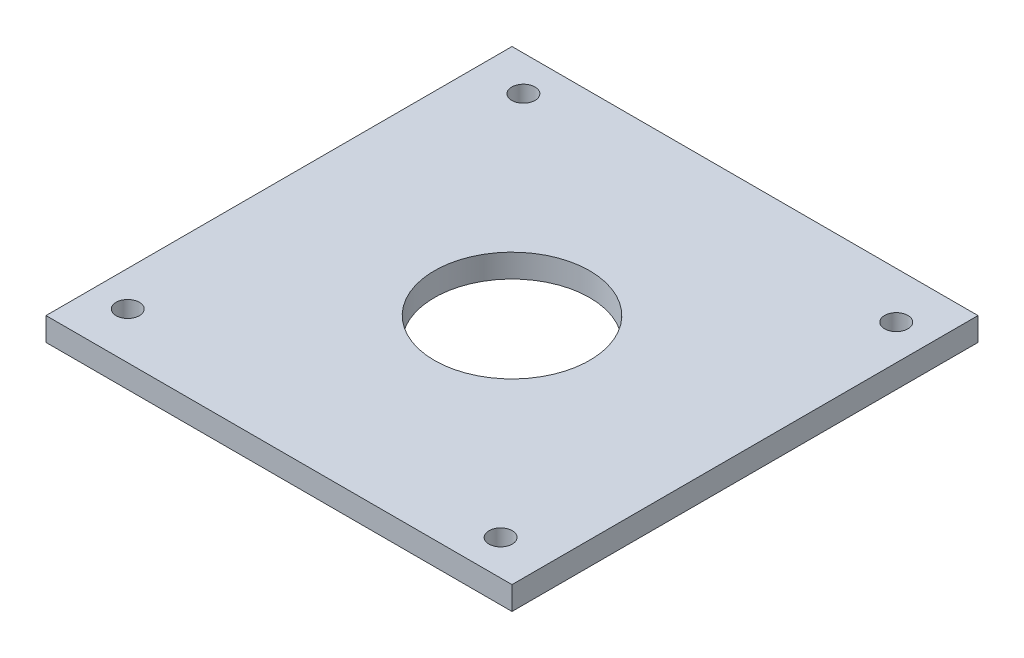
ISO-10303-21;
HEADER;
FILE_DESCRIPTION(('STEP AP214'),'2;1');
FILE_NAME('part.step','',(''),(''),'','','');
FILE_SCHEMA(('AUTOMOTIVE_DESIGN { 1 0 10303 214 1 1 1 1 }'));
ENDSEC;
DATA;
#1=APPLICATION_CONTEXT('core data for automotive mechanical design processes');
#2=APPLICATION_PROTOCOL_DEFINITION('international standard','automotive_design',2000,#1);
#3=PRODUCT_CONTEXT('',#1,'mechanical');
#4=PRODUCT('Part','Part','',(#3));
#5=PRODUCT_RELATED_PRODUCT_CATEGORY('part','',(#4));
#6=PRODUCT_DEFINITION_FORMATION('','',#4);
#7=PRODUCT_DEFINITION_CONTEXT('part definition',#1,'design');
#8=PRODUCT_DEFINITION('design','',#6,#7);
#9=PRODUCT_DEFINITION_SHAPE('','',#8);
#10=(LENGTH_UNIT() NAMED_UNIT(*) SI_UNIT(.MILLI.,.METRE.));
#11=(NAMED_UNIT(*) PLANE_ANGLE_UNIT() SI_UNIT($,.RADIAN.));
#12=(NAMED_UNIT(*) SI_UNIT($,.STERADIAN.) SOLID_ANGLE_UNIT());
#13=UNCERTAINTY_MEASURE_WITH_UNIT(LENGTH_MEASURE(1.E-05),#10,'distance_accuracy_value','');
#14=(GEOMETRIC_REPRESENTATION_CONTEXT(3) GLOBAL_UNCERTAINTY_ASSIGNED_CONTEXT((#13)) GLOBAL_UNIT_ASSIGNED_CONTEXT((#10,
#11,#12)) REPRESENTATION_CONTEXT('',''));
#15=CARTESIAN_POINT('',(0.,0.,0.));
#16=DIRECTION('',(0.,0.,1.));
#17=DIRECTION('',(1.,0.,0.));
#18=AXIS2_PLACEMENT_3D('',#15,#16,#17);
#19=CARTESIAN_POINT('',(0.,3.,0.));
#20=DIRECTION('',(0.,1.,0.));
#21=DIRECTION('',(0.,0.,1.));
#22=AXIS2_PLACEMENT_3D('',#19,#20,#21);
#23=PLANE('',#22);
#24=CARTESIAN_POINT('',(-25.4708550933274,3.,24.0049065987501));
#25=DIRECTION('',(0.,1.,0.));
#26=DIRECTION('',(0.,0.,1.));
#27=AXIS2_PLACEMENT_3D('',#24,#25,#26);
#28=CIRCLE('',#27,1.500000000001);
#29=CARTESIAN_POINT('',(-25.4708550933274,3.,25.5049065987511));
#30=VERTEX_POINT('',#29);
#31=EDGE_CURVE('E133',#30,#30,#28,.T.);
#32=ORIENTED_EDGE('',*,*,#31,.F.);
#33=EDGE_LOOP('',(#32));
#34=FACE_BOUND('',#33,.T.);
#35=CARTESIAN_POINT('',(0.,3.,0.));
#36=DIRECTION('',(0.,1.,0.));
#37=DIRECTION('',(0.,0.,1.));
#38=AXIS2_PLACEMENT_3D('',#35,#36,#37);
#39=CIRCLE('',#38,10.);
#40=CARTESIAN_POINT('',(0.,3.,10.));
#41=VERTEX_POINT('',#40);
#42=EDGE_CURVE('E121',#41,#41,#39,.T.);
#43=ORIENTED_EDGE('',*,*,#42,.F.);
#44=EDGE_LOOP('',(#43));
#45=FACE_BOUND('',#44,.T.);
#46=DIRECTION('',(0.,0.,-1.));
#47=VECTOR('',#46,1.);
#48=CARTESIAN_POINT('',(30.,3.,-30.));
#49=LINE('',#48,#47);
#50=CARTESIAN_POINT('',(30.,3.,30.));
#51=VERTEX_POINT('',#50);
#52=CARTESIAN_POINT('',(30.,3.,-30.));
#53=VERTEX_POINT('',#52);
#54=EDGE_CURVE('E91',#51,#53,#49,.T.);
#55=ORIENTED_EDGE('',*,*,#54,.T.);
#56=DIRECTION('',(-1.,0.,0.));
#57=VECTOR('',#56,1.);
#58=CARTESIAN_POINT('',(-30.,3.,-30.));
#59=LINE('',#58,#57);
#60=CARTESIAN_POINT('',(-30.,3.,-30.));
#61=VERTEX_POINT('',#60);
#62=EDGE_CURVE('E86',#53,#61,#59,.T.);
#63=ORIENTED_EDGE('',*,*,#62,.T.);
#64=DIRECTION('',(0.,0.,1.));
#65=VECTOR('',#64,1.);
#66=CARTESIAN_POINT('',(-30.,3.,-30.));
#67=LINE('',#66,#65);
#68=CARTESIAN_POINT('',(-30.,3.,30.));
#69=VERTEX_POINT('',#68);
#70=EDGE_CURVE('E89',#61,#69,#67,.T.);
#71=ORIENTED_EDGE('',*,*,#70,.T.);
#72=DIRECTION('',(1.,0.,0.));
#73=VECTOR('',#72,1.);
#74=CARTESIAN_POINT('',(-30.,3.,30.));
#75=LINE('',#74,#73);
#76=EDGE_CURVE('E56',#69,#51,#75,.T.);
#77=ORIENTED_EDGE('',*,*,#76,.T.);
#78=EDGE_LOOP('',(#55,#63,#71,#77));
#79=FACE_BOUND('',#78,.T.);
#80=CARTESIAN_POINT('',(25.4708550933288,3.,-24.0049065987487));
#81=DIRECTION('',(0.,1.,0.));
#82=DIRECTION('',(0.,0.,1.));
#83=AXIS2_PLACEMENT_3D('',#80,#81,#82);
#84=CIRCLE('',#83,1.5);
#85=CARTESIAN_POINT('',(25.4708550933288,3.,-22.5049065987487));
#86=VERTEX_POINT('',#85);
#87=EDGE_CURVE('E106',#86,#86,#84,.T.);
#88=ORIENTED_EDGE('',*,*,#87,.F.);
#89=EDGE_LOOP('',(#88));
#90=FACE_BOUND('',#89,.T.);
#91=CARTESIAN_POINT('',(24.0049065987501,3.,25.4708550933288));
#92=DIRECTION('',(0.,1.,0.));
#93=DIRECTION('',(0.,0.,1.));
#94=AXIS2_PLACEMENT_3D('',#91,#92,#93);
#95=CIRCLE('',#94,1.49999999999961);
#96=CARTESIAN_POINT('',(24.0049065987501,3.,26.9708550933284));
#97=VERTEX_POINT('',#96);
#98=EDGE_CURVE('E127',#97,#97,#95,.T.);
#99=ORIENTED_EDGE('',*,*,#98,.F.);
#100=EDGE_LOOP('',(#99));
#101=FACE_BOUND('',#100,.T.);
#102=CARTESIAN_POINT('',(-24.0049065987487,3.,-25.4708550933273));
#103=DIRECTION('',(0.,1.,0.));
#104=DIRECTION('',(0.,0.,1.));
#105=AXIS2_PLACEMENT_3D('',#102,#103,#104);
#106=CIRCLE('',#105,1.5000000000015);
#107=CARTESIAN_POINT('',(-24.0049065987487,3.,-23.9708550933258));
#108=VERTEX_POINT('',#107);
#109=EDGE_CURVE('E139',#108,#108,#106,.T.);
#110=ORIENTED_EDGE('',*,*,#109,.F.);
#111=EDGE_LOOP('',(#110));
#112=FACE_BOUND('',#111,.T.);
#113=ADVANCED_FACE('F39',(#34,#45,#79,#90,#101,#112),#23,.T.);
#114=CARTESIAN_POINT('',(0.,0.,0.));
#115=DIRECTION('',(0.,1.,0.));
#116=DIRECTION('',(0.,0.,1.));
#117=AXIS2_PLACEMENT_3D('',#114,#115,#116);
#118=PLANE('',#117);
#119=DIRECTION('',(0.,0.,-1.));
#120=VECTOR('',#119,1.);
#121=CARTESIAN_POINT('',(30.,0.,-30.));
#122=LINE('',#121,#120);
#123=CARTESIAN_POINT('',(30.,0.,30.));
#124=VERTEX_POINT('',#123);
#125=CARTESIAN_POINT('',(30.,0.,-30.));
#126=VERTEX_POINT('',#125);
#127=EDGE_CURVE('E103',#124,#126,#122,.T.);
#128=ORIENTED_EDGE('',*,*,#127,.F.);
#129=DIRECTION('',(1.,0.,0.));
#130=VECTOR('',#129,1.);
#131=CARTESIAN_POINT('',(-30.,0.,30.));
#132=LINE('',#131,#130);
#133=CARTESIAN_POINT('',(-30.,0.,30.));
#134=VERTEX_POINT('',#133);
#135=EDGE_CURVE('E79',#134,#124,#132,.T.);
#136=ORIENTED_EDGE('',*,*,#135,.F.);
#137=DIRECTION('',(0.,0.,1.));
#138=VECTOR('',#137,1.);
#139=CARTESIAN_POINT('',(-30.,0.,-30.));
#140=LINE('',#139,#138);
#141=CARTESIAN_POINT('',(-30.,0.,-30.));
#142=VERTEX_POINT('',#141);
#143=EDGE_CURVE('E73',#142,#134,#140,.T.);
#144=ORIENTED_EDGE('',*,*,#143,.F.);
#145=DIRECTION('',(-1.,0.,0.));
#146=VECTOR('',#145,1.);
#147=CARTESIAN_POINT('',(-30.,0.,-30.));
#148=LINE('',#147,#146);
#149=EDGE_CURVE('E95',#126,#142,#148,.T.);
#150=ORIENTED_EDGE('',*,*,#149,.F.);
#151=EDGE_LOOP('',(#128,#136,#144,#150));
#152=FACE_BOUND('',#151,.T.);
#153=CARTESIAN_POINT('',(25.4708550933288,0.,-24.0049065987487));
#154=DIRECTION('',(0.,1.,0.));
#155=DIRECTION('',(0.,0.,1.));
#156=AXIS2_PLACEMENT_3D('',#153,#154,#155);
#157=CIRCLE('',#156,1.5);
#158=CARTESIAN_POINT('',(25.4708550933288,0.,-22.5049065987487));
#159=VERTEX_POINT('',#158);
#160=EDGE_CURVE('E118',#159,#159,#157,.T.);
#161=ORIENTED_EDGE('',*,*,#160,.T.);
#162=EDGE_LOOP('',(#161));
#163=FACE_BOUND('',#162,.T.);
#164=CARTESIAN_POINT('',(0.,0.,0.));
#165=DIRECTION('',(0.,1.,0.));
#166=DIRECTION('',(0.,0.,1.));
#167=AXIS2_PLACEMENT_3D('',#164,#165,#166);
#168=CIRCLE('',#167,10.);
#169=CARTESIAN_POINT('',(0.,0.,10.));
#170=VERTEX_POINT('',#169);
#171=EDGE_CURVE('E124',#170,#170,#168,.T.);
#172=ORIENTED_EDGE('',*,*,#171,.T.);
#173=EDGE_LOOP('',(#172));
#174=FACE_BOUND('',#173,.T.);
#175=CARTESIAN_POINT('',(24.0049065987501,0.,25.4708550933288));
#176=DIRECTION('',(0.,1.,0.));
#177=DIRECTION('',(0.,0.,1.));
#178=AXIS2_PLACEMENT_3D('',#175,#176,#177);
#179=CIRCLE('',#178,1.49999999999961);
#180=CARTESIAN_POINT('',(24.0049065987501,0.,26.9708550933284));
#181=VERTEX_POINT('',#180);
#182=EDGE_CURVE('E130',#181,#181,#179,.T.);
#183=ORIENTED_EDGE('',*,*,#182,.T.);
#184=EDGE_LOOP('',(#183));
#185=FACE_BOUND('',#184,.T.);
#186=CARTESIAN_POINT('',(-25.4708550933274,0.,24.0049065987501));
#187=DIRECTION('',(0.,1.,0.));
#188=DIRECTION('',(0.,0.,1.));
#189=AXIS2_PLACEMENT_3D('',#186,#187,#188);
#190=CIRCLE('',#189,1.500000000001);
#191=CARTESIAN_POINT('',(-25.4708550933274,0.,25.5049065987511));
#192=VERTEX_POINT('',#191);
#193=EDGE_CURVE('E136',#192,#192,#190,.T.);
#194=ORIENTED_EDGE('',*,*,#193,.T.);
#195=EDGE_LOOP('',(#194));
#196=FACE_BOUND('',#195,.T.);
#197=CARTESIAN_POINT('',(-24.0049065987487,0.,-25.4708550933273));
#198=DIRECTION('',(0.,1.,0.));
#199=DIRECTION('',(0.,0.,1.));
#200=AXIS2_PLACEMENT_3D('',#197,#198,#199);
#201=CIRCLE('',#200,1.5000000000015);
#202=CARTESIAN_POINT('',(-24.0049065987487,0.,-23.9708550933258));
#203=VERTEX_POINT('',#202);
#204=EDGE_CURVE('E142',#203,#203,#201,.T.);
#205=ORIENTED_EDGE('',*,*,#204,.T.);
#206=EDGE_LOOP('',(#205));
#207=FACE_BOUND('',#206,.T.);
#208=ADVANCED_FACE('F114',(#152,#163,#174,#185,#196,#207),#118,.F.);
#209=CARTESIAN_POINT('',(30.,3.,-30.));
#210=DIRECTION('',(-1.,0.,0.));
#211=DIRECTION('',(0.,0.,1.));
#212=AXIS2_PLACEMENT_3D('',#209,#210,#211);
#213=PLANE('',#212);
#214=ORIENTED_EDGE('',*,*,#127,.T.);
#215=DIRECTION('',(0.,-1.,0.));
#216=VECTOR('',#215,1.);
#217=CARTESIAN_POINT('',(30.,3.,-30.));
#218=LINE('',#217,#216);
#219=EDGE_CURVE('E11',#53,#126,#218,.T.);
#220=ORIENTED_EDGE('',*,*,#219,.F.);
#221=ORIENTED_EDGE('',*,*,#54,.F.);
#222=DIRECTION('',(0.,-1.,0.));
#223=VECTOR('',#222,1.);
#224=CARTESIAN_POINT('',(30.,3.,30.));
#225=LINE('',#224,#223);
#226=EDGE_CURVE('E99',#51,#124,#225,.T.);
#227=ORIENTED_EDGE('',*,*,#226,.T.);
#228=EDGE_LOOP('',(#214,#220,#221,#227));
#229=FACE_BOUND('',#228,.T.);
#230=ADVANCED_FACE('F41',(#229),#213,.F.);
#231=CARTESIAN_POINT('',(-30.,3.,-30.));
#232=DIRECTION('',(0.,0.,1.));
#233=DIRECTION('',(1.,0.,0.));
#234=AXIS2_PLACEMENT_3D('',#231,#232,#233);
#235=PLANE('',#234);
#236=ORIENTED_EDGE('',*,*,#149,.T.);
#237=DIRECTION('',(0.,-1.,0.));
#238=VECTOR('',#237,1.);
#239=CARTESIAN_POINT('',(-30.,3.,-30.));
#240=LINE('',#239,#238);
#241=EDGE_CURVE('E48',#61,#142,#240,.T.);
#242=ORIENTED_EDGE('',*,*,#241,.F.);
#243=ORIENTED_EDGE('',*,*,#62,.F.);
#244=ORIENTED_EDGE('',*,*,#219,.T.);
#245=EDGE_LOOP('',(#236,#242,#243,#244));
#246=FACE_BOUND('',#245,.T.);
#247=ADVANCED_FACE('F94',(#246),#235,.F.);
#248=CARTESIAN_POINT('',(-30.,3.,-30.));
#249=DIRECTION('',(1.,0.,0.));
#250=DIRECTION('',(0.,0.,-1.));
#251=AXIS2_PLACEMENT_3D('',#248,#249,#250);
#252=PLANE('',#251);
#253=ORIENTED_EDGE('',*,*,#143,.T.);
#254=DIRECTION('',(0.,-1.,0.));
#255=VECTOR('',#254,1.);
#256=CARTESIAN_POINT('',(-30.,3.,30.));
#257=LINE('',#256,#255);
#258=EDGE_CURVE('E96',#69,#134,#257,.T.);
#259=ORIENTED_EDGE('',*,*,#258,.F.);
#260=ORIENTED_EDGE('',*,*,#70,.F.);
#261=ORIENTED_EDGE('',*,*,#241,.T.);
#262=EDGE_LOOP('',(#253,#259,#260,#261));
#263=FACE_BOUND('',#262,.T.);
#264=ADVANCED_FACE('F97',(#263),#252,.F.);
#265=CARTESIAN_POINT('',(-30.,3.,30.));
#266=DIRECTION('',(0.,0.,-1.));
#267=DIRECTION('',(-1.,0.,0.));
#268=AXIS2_PLACEMENT_3D('',#265,#266,#267);
#269=PLANE('',#268);
#270=ORIENTED_EDGE('',*,*,#135,.T.);
#271=ORIENTED_EDGE('',*,*,#226,.F.);
#272=ORIENTED_EDGE('',*,*,#76,.F.);
#273=ORIENTED_EDGE('',*,*,#258,.T.);
#274=EDGE_LOOP('',(#270,#271,#272,#273));
#275=FACE_BOUND('',#274,.T.);
#276=ADVANCED_FACE('F111',(#275),#269,.F.);
#277=CARTESIAN_POINT('',(25.4708550933288,3.,-24.0049065987487));
#278=DIRECTION('',(0.,-1.,0.));
#279=DIRECTION('',(0.,0.,-1.));
#280=AXIS2_PLACEMENT_3D('',#277,#278,#279);
#281=CYLINDRICAL_SURFACE('',#280,1.5);
#282=ORIENTED_EDGE('',*,*,#87,.T.);
#283=EDGE_LOOP('',(#282));
#284=FACE_BOUND('',#283,.T.);
#285=ORIENTED_EDGE('',*,*,#160,.F.);
#286=EDGE_LOOP('',(#285));
#287=FACE_BOUND('',#286,.T.);
#288=ADVANCED_FACE('F161',(#284,#287),#281,.F.);
#289=CARTESIAN_POINT('',(0.,3.,0.));
#290=DIRECTION('',(0.,-1.,0.));
#291=DIRECTION('',(0.,0.,-1.));
#292=AXIS2_PLACEMENT_3D('',#289,#290,#291);
#293=CYLINDRICAL_SURFACE('',#292,10.);
#294=ORIENTED_EDGE('',*,*,#42,.T.);
#295=EDGE_LOOP('',(#294));
#296=FACE_BOUND('',#295,.T.);
#297=ORIENTED_EDGE('',*,*,#171,.F.);
#298=EDGE_LOOP('',(#297));
#299=FACE_BOUND('',#298,.T.);
#300=ADVANCED_FACE('F207',(#296,#299),#293,.F.);
#301=CARTESIAN_POINT('',(24.0049065987501,3.,25.4708550933288));
#302=DIRECTION('',(0.,-1.,0.));
#303=DIRECTION('',(0.,0.,-1.));
#304=AXIS2_PLACEMENT_3D('',#301,#302,#303);
#305=CYLINDRICAL_SURFACE('',#304,1.49999999999961);
#306=ORIENTED_EDGE('',*,*,#98,.T.);
#307=EDGE_LOOP('',(#306));
#308=FACE_BOUND('',#307,.T.);
#309=ORIENTED_EDGE('',*,*,#182,.F.);
#310=EDGE_LOOP('',(#309));
#311=FACE_BOUND('',#310,.T.);
#312=ADVANCED_FACE('F215',(#308,#311),#305,.F.);
#313=CARTESIAN_POINT('',(-25.4708550933274,3.,24.0049065987501));
#314=DIRECTION('',(0.,-1.,0.));
#315=DIRECTION('',(0.,0.,-1.));
#316=AXIS2_PLACEMENT_3D('',#313,#314,#315);
#317=CYLINDRICAL_SURFACE('',#316,1.500000000001);
#318=ORIENTED_EDGE('',*,*,#31,.T.);
#319=EDGE_LOOP('',(#318));
#320=FACE_BOUND('',#319,.T.);
#321=ORIENTED_EDGE('',*,*,#193,.F.);
#322=EDGE_LOOP('',(#321));
#323=FACE_BOUND('',#322,.T.);
#324=ADVANCED_FACE('F223',(#320,#323),#317,.F.);
#325=CARTESIAN_POINT('',(-24.0049065987487,3.,-25.4708550933273));
#326=DIRECTION('',(0.,-1.,0.));
#327=DIRECTION('',(0.,0.,-1.));
#328=AXIS2_PLACEMENT_3D('',#325,#326,#327);
#329=CYLINDRICAL_SURFACE('',#328,1.5000000000015);
#330=ORIENTED_EDGE('',*,*,#109,.T.);
#331=EDGE_LOOP('',(#330));
#332=FACE_BOUND('',#331,.T.);
#333=ORIENTED_EDGE('',*,*,#204,.F.);
#334=EDGE_LOOP('',(#333));
#335=FACE_BOUND('',#334,.T.);
#336=ADVANCED_FACE('F148',(#332,#335),#329,.F.);
#337=CLOSED_SHELL('',(#113,#208,#230,#247,#264,#276,#288,#300,#312,#324,#336));
#338=MANIFOLD_SOLID_BREP('B2',#337);
#339=ADVANCED_BREP_SHAPE_REPRESENTATION('',(#18,#338),#14);
#340=SHAPE_DEFINITION_REPRESENTATION(#9,#339);
ENDSEC;
END-ISO-10303-21;
